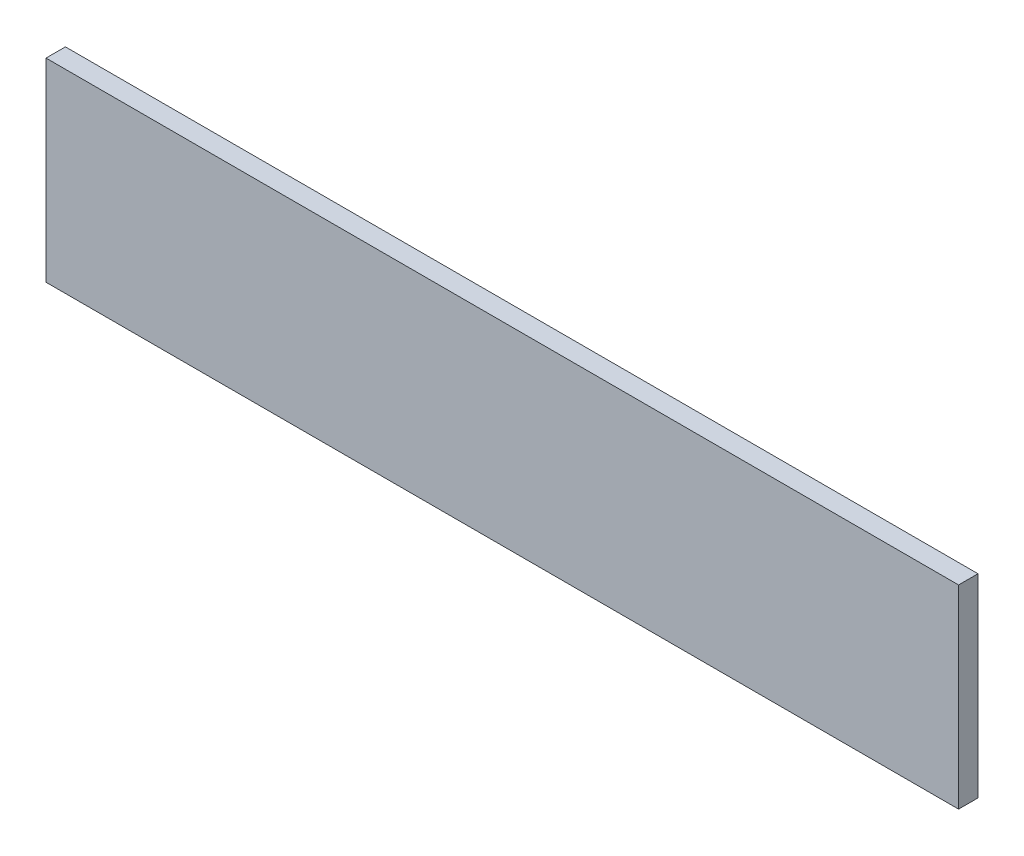
ISO-10303-21;
HEADER;
FILE_DESCRIPTION(('STEP AP214'),'2;1');
FILE_NAME('part.step','',(''),(''),'','','');
FILE_SCHEMA(('AUTOMOTIVE_DESIGN { 1 0 10303 214 1 1 1 1 }'));
ENDSEC;
DATA;
#1=APPLICATION_CONTEXT('core data for automotive mechanical design processes');
#2=APPLICATION_PROTOCOL_DEFINITION('international standard','automotive_design',2000,#1);
#3=PRODUCT_CONTEXT('',#1,'mechanical');
#4=PRODUCT('Part','Part','',(#3));
#5=PRODUCT_RELATED_PRODUCT_CATEGORY('part','',(#4));
#6=PRODUCT_DEFINITION_FORMATION('','',#4);
#7=PRODUCT_DEFINITION_CONTEXT('part definition',#1,'design');
#8=PRODUCT_DEFINITION('design','',#6,#7);
#9=PRODUCT_DEFINITION_SHAPE('','',#8);
#10=(LENGTH_UNIT() NAMED_UNIT(*) SI_UNIT(.MILLI.,.METRE.));
#11=(NAMED_UNIT(*) PLANE_ANGLE_UNIT() SI_UNIT($,.RADIAN.));
#12=(NAMED_UNIT(*) SI_UNIT($,.STERADIAN.) SOLID_ANGLE_UNIT());
#13=UNCERTAINTY_MEASURE_WITH_UNIT(LENGTH_MEASURE(1.E-05),#10,'distance_accuracy_value','');
#14=(GEOMETRIC_REPRESENTATION_CONTEXT(3) GLOBAL_UNCERTAINTY_ASSIGNED_CONTEXT((#13)) GLOBAL_UNIT_ASSIGNED_CONTEXT((#10,
#11,#12)) REPRESENTATION_CONTEXT('',''));
#15=CARTESIAN_POINT('',(0.,0.,0.));
#16=DIRECTION('',(0.,0.,1.));
#17=DIRECTION('',(1.,0.,0.));
#18=AXIS2_PLACEMENT_3D('',#15,#16,#17);
#19=CARTESIAN_POINT('',(149.225,-31.75,6.35));
#20=DIRECTION('',(-1.,0.,0.));
#21=DIRECTION('',(0.,0.,1.));
#22=AXIS2_PLACEMENT_3D('',#19,#20,#21);
#23=PLANE('',#22);
#24=DIRECTION('',(0.,1.,0.));
#25=VECTOR('',#24,1.);
#26=CARTESIAN_POINT('',(149.225,-31.75,0.));
#27=LINE('',#26,#25);
#28=CARTESIAN_POINT('',(149.225,-31.75,0.));
#29=VERTEX_POINT('',#28);
#30=CARTESIAN_POINT('',(149.225,31.75,0.));
#31=VERTEX_POINT('',#30);
#32=EDGE_CURVE('E98',#29,#31,#27,.T.);
#33=ORIENTED_EDGE('',*,*,#32,.T.);
#34=DIRECTION('',(0.,0.,-1.));
#35=VECTOR('',#34,1.);
#36=CARTESIAN_POINT('',(149.225,31.75,6.35));
#37=LINE('',#36,#35);
#38=CARTESIAN_POINT('',(149.225,31.75,6.35));
#39=VERTEX_POINT('',#38);
#40=EDGE_CURVE('E11',#39,#31,#37,.T.);
#41=ORIENTED_EDGE('',*,*,#40,.F.);
#42=DIRECTION('',(0.,1.,0.));
#43=VECTOR('',#42,1.);
#44=CARTESIAN_POINT('',(149.225,-31.75,6.35));
#45=LINE('',#44,#43);
#46=CARTESIAN_POINT('',(149.225,-31.75,6.35));
#47=VERTEX_POINT('',#46);
#48=EDGE_CURVE('E86',#47,#39,#45,.T.);
#49=ORIENTED_EDGE('',*,*,#48,.F.);
#50=DIRECTION('',(0.,0.,-1.));
#51=VECTOR('',#50,1.);
#52=CARTESIAN_POINT('',(149.225,-31.75,6.35));
#53=LINE('',#52,#51);
#54=EDGE_CURVE('E94',#47,#29,#53,.T.);
#55=ORIENTED_EDGE('',*,*,#54,.T.);
#56=EDGE_LOOP('',(#33,#41,#49,#55));
#57=FACE_BOUND('',#56,.T.);
#58=ADVANCED_FACE('F35',(#57),#23,.F.);
#59=CARTESIAN_POINT('',(-149.225,31.75,6.35));
#60=DIRECTION('',(0.,-1.,0.));
#61=DIRECTION('',(0.,0.,-1.));
#62=AXIS2_PLACEMENT_3D('',#59,#60,#61);
#63=PLANE('',#62);
#64=DIRECTION('',(-1.,0.,0.));
#65=VECTOR('',#64,1.);
#66=CARTESIAN_POINT('',(-149.225,31.75,0.));
#67=LINE('',#66,#65);
#68=CARTESIAN_POINT('',(-149.225,31.75,0.));
#69=VERTEX_POINT('',#68);
#70=EDGE_CURVE('E90',#31,#69,#67,.T.);
#71=ORIENTED_EDGE('',*,*,#70,.T.);
#72=DIRECTION('',(0.,0.,-1.));
#73=VECTOR('',#72,1.);
#74=CARTESIAN_POINT('',(-149.225,31.75,6.35));
#75=LINE('',#74,#73);
#76=CARTESIAN_POINT('',(-149.225,31.75,6.35));
#77=VERTEX_POINT('',#76);
#78=EDGE_CURVE('E43',#77,#69,#75,.T.);
#79=ORIENTED_EDGE('',*,*,#78,.F.);
#80=DIRECTION('',(-1.,0.,0.));
#81=VECTOR('',#80,1.);
#82=CARTESIAN_POINT('',(-149.225,31.75,6.35));
#83=LINE('',#82,#81);
#84=EDGE_CURVE('E81',#39,#77,#83,.T.);
#85=ORIENTED_EDGE('',*,*,#84,.F.);
#86=ORIENTED_EDGE('',*,*,#40,.T.);
#87=EDGE_LOOP('',(#71,#79,#85,#86));
#88=FACE_BOUND('',#87,.T.);
#89=ADVANCED_FACE('F89',(#88),#63,.F.);
#90=CARTESIAN_POINT('',(-149.225,-31.75,6.35));
#91=DIRECTION('',(1.,0.,0.));
#92=DIRECTION('',(0.,0.,-1.));
#93=AXIS2_PLACEMENT_3D('',#90,#91,#92);
#94=PLANE('',#93);
#95=DIRECTION('',(0.,-1.,0.));
#96=VECTOR('',#95,1.);
#97=CARTESIAN_POINT('',(-149.225,-31.75,0.));
#98=LINE('',#97,#96);
#99=CARTESIAN_POINT('',(-149.225,-31.75,0.));
#100=VERTEX_POINT('',#99);
#101=EDGE_CURVE('E68',#69,#100,#98,.T.);
#102=ORIENTED_EDGE('',*,*,#101,.T.);
#103=DIRECTION('',(0.,0.,-1.));
#104=VECTOR('',#103,1.);
#105=CARTESIAN_POINT('',(-149.225,-31.75,6.35));
#106=LINE('',#105,#104);
#107=CARTESIAN_POINT('',(-149.225,-31.75,6.35));
#108=VERTEX_POINT('',#107);
#109=EDGE_CURVE('E91',#108,#100,#106,.T.);
#110=ORIENTED_EDGE('',*,*,#109,.F.);
#111=DIRECTION('',(0.,-1.,0.));
#112=VECTOR('',#111,1.);
#113=CARTESIAN_POINT('',(-149.225,-31.75,6.35));
#114=LINE('',#113,#112);
#115=EDGE_CURVE('E84',#77,#108,#114,.T.);
#116=ORIENTED_EDGE('',*,*,#115,.F.);
#117=ORIENTED_EDGE('',*,*,#78,.T.);
#118=EDGE_LOOP('',(#102,#110,#116,#117));
#119=FACE_BOUND('',#118,.T.);
#120=ADVANCED_FACE('F92',(#119),#94,.F.);
#121=CARTESIAN_POINT('',(-149.225,-31.75,6.35));
#122=DIRECTION('',(0.,1.,0.));
#123=DIRECTION('',(0.,0.,1.));
#124=AXIS2_PLACEMENT_3D('',#121,#122,#123);
#125=PLANE('',#124);
#126=DIRECTION('',(1.,0.,0.));
#127=VECTOR('',#126,1.);
#128=CARTESIAN_POINT('',(-149.225,-31.75,0.));
#129=LINE('',#128,#127);
#130=EDGE_CURVE('E74',#100,#29,#129,.T.);
#131=ORIENTED_EDGE('',*,*,#130,.T.);
#132=ORIENTED_EDGE('',*,*,#54,.F.);
#133=DIRECTION('',(1.,0.,0.));
#134=VECTOR('',#133,1.);
#135=CARTESIAN_POINT('',(-149.225,-31.75,6.35));
#136=LINE('',#135,#134);
#137=EDGE_CURVE('E51',#108,#47,#136,.T.);
#138=ORIENTED_EDGE('',*,*,#137,.F.);
#139=ORIENTED_EDGE('',*,*,#109,.T.);
#140=EDGE_LOOP('',(#131,#132,#138,#139));
#141=FACE_BOUND('',#140,.T.);
#142=ADVANCED_FACE('F105',(#141),#125,.F.);
#143=CARTESIAN_POINT('',(0.,0.,6.35));
#144=DIRECTION('',(0.,0.,-1.));
#145=DIRECTION('',(-1.,0.,0.));
#146=AXIS2_PLACEMENT_3D('',#143,#144,#145);
#147=PLANE('',#146);
#148=ORIENTED_EDGE('',*,*,#48,.T.);
#149=ORIENTED_EDGE('',*,*,#84,.T.);
#150=ORIENTED_EDGE('',*,*,#115,.T.);
#151=ORIENTED_EDGE('',*,*,#137,.T.);
#152=EDGE_LOOP('',(#148,#149,#150,#151));
#153=FACE_BOUND('',#152,.T.);
#154=ADVANCED_FACE('F82',(#153),#147,.F.);
#155=CARTESIAN_POINT('',(0.,0.,0.));
#156=DIRECTION('',(0.,0.,-1.));
#157=DIRECTION('',(-1.,0.,0.));
#158=AXIS2_PLACEMENT_3D('',#155,#156,#157);
#159=PLANE('',#158);
#160=ORIENTED_EDGE('',*,*,#32,.F.);
#161=ORIENTED_EDGE('',*,*,#130,.F.);
#162=ORIENTED_EDGE('',*,*,#101,.F.);
#163=ORIENTED_EDGE('',*,*,#70,.F.);
#164=EDGE_LOOP('',(#160,#161,#162,#163));
#165=FACE_BOUND('',#164,.T.);
#166=ADVANCED_FACE('F108',(#165),#159,.T.);
#167=CLOSED_SHELL('',(#58,#89,#120,#142,#154,#166));
#168=MANIFOLD_SOLID_BREP('B2',#167);
#169=ADVANCED_BREP_SHAPE_REPRESENTATION('',(#18,#168),#14);
#170=SHAPE_DEFINITION_REPRESENTATION(#9,#169);
ENDSEC;
END-ISO-10303-21;
